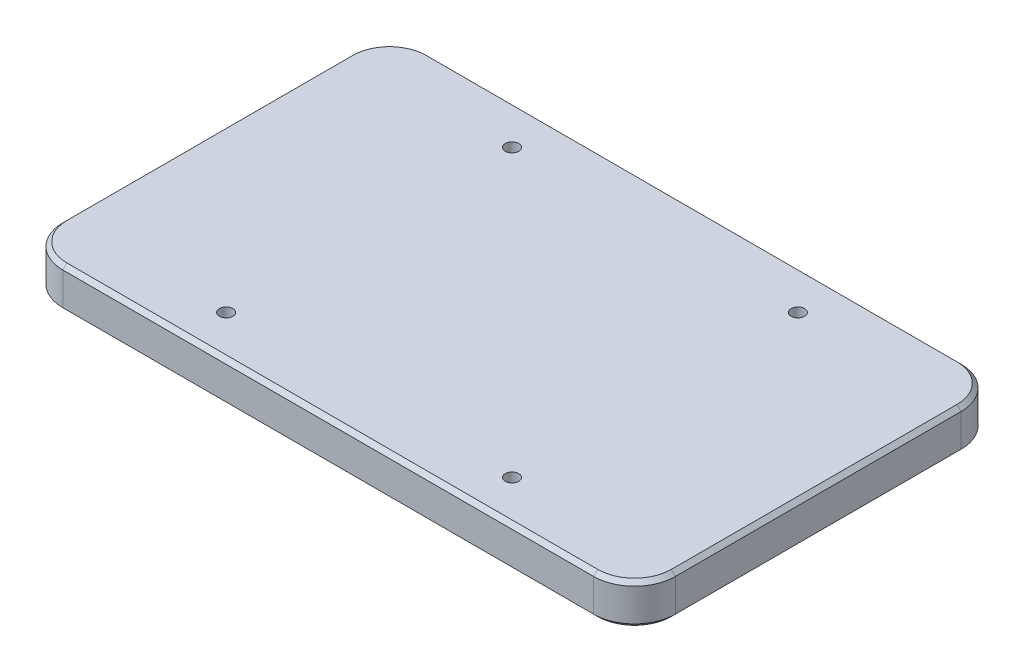
ISO-10303-21;
HEADER;
FILE_DESCRIPTION(('STEP AP214'),'2;1');
FILE_NAME('part.step','',(''),(''),'','','');
FILE_SCHEMA(('AUTOMOTIVE_DESIGN { 1 0 10303 214 1 1 1 1 }'));
ENDSEC;
DATA;
#1=APPLICATION_CONTEXT('core data for automotive mechanical design processes');
#2=APPLICATION_PROTOCOL_DEFINITION('international standard','automotive_design',2000,#1);
#3=PRODUCT_CONTEXT('',#1,'mechanical');
#4=PRODUCT('Part','Part','',(#3));
#5=PRODUCT_RELATED_PRODUCT_CATEGORY('part','',(#4));
#6=PRODUCT_DEFINITION_FORMATION('','',#4);
#7=PRODUCT_DEFINITION_CONTEXT('part definition',#1,'design');
#8=PRODUCT_DEFINITION('design','',#6,#7);
#9=PRODUCT_DEFINITION_SHAPE('','',#8);
#10=(LENGTH_UNIT() NAMED_UNIT(*) SI_UNIT(.MILLI.,.METRE.));
#11=(NAMED_UNIT(*) PLANE_ANGLE_UNIT() SI_UNIT($,.RADIAN.));
#12=(NAMED_UNIT(*) SI_UNIT($,.STERADIAN.) SOLID_ANGLE_UNIT());
#13=UNCERTAINTY_MEASURE_WITH_UNIT(LENGTH_MEASURE(1.E-05),#10,'distance_accuracy_value','');
#14=(GEOMETRIC_REPRESENTATION_CONTEXT(3) GLOBAL_UNCERTAINTY_ASSIGNED_CONTEXT((#13)) GLOBAL_UNIT_ASSIGNED_CONTEXT((#10,
#11,#12)) REPRESENTATION_CONTEXT('',''));
#15=CARTESIAN_POINT('',(0.,0.,0.));
#16=DIRECTION('',(0.,0.,1.));
#17=DIRECTION('',(1.,0.,0.));
#18=AXIS2_PLACEMENT_3D('',#15,#16,#17);
#19=CARTESIAN_POINT('',(0.,10.,0.));
#20=DIRECTION('',(1.,0.,0.));
#21=DIRECTION('',(0.,0.,-1.));
#22=AXIS2_PLACEMENT_3D('',#19,#20,#21);
#23=PLANE('',#22);
#24=DIRECTION('',(0.,-1.,0.));
#25=VECTOR('',#24,1.);
#26=CARTESIAN_POINT('',(0.,10.,80.));
#27=LINE('',#26,#25);
#28=CARTESIAN_POINT('',(0.,1.,80.));
#29=VERTEX_POINT('',#28);
#30=CARTESIAN_POINT('',(0.,9.,80.));
#31=VERTEX_POINT('',#30);
#32=EDGE_CURVE('E234',#29,#31,#27,.F.);
#33=ORIENTED_EDGE('',*,*,#32,.T.);
#34=DIRECTION('',(0.,0.,-1.));
#35=VECTOR('',#34,1.);
#36=CARTESIAN_POINT('',(0.,9.,10.));
#37=LINE('',#36,#35);
#38=CARTESIAN_POINT('',(0.,9.,10.));
#39=VERTEX_POINT('',#38);
#40=EDGE_CURVE('E354',#31,#39,#37,.T.);
#41=ORIENTED_EDGE('',*,*,#40,.T.);
#42=DIRECTION('',(0.,-1.,0.));
#43=VECTOR('',#42,1.);
#44=CARTESIAN_POINT('',(0.,10.,10.));
#45=LINE('',#44,#43);
#46=CARTESIAN_POINT('',(0.,1.,10.));
#47=VERTEX_POINT('',#46);
#48=EDGE_CURVE('E240',#39,#47,#45,.T.);
#49=ORIENTED_EDGE('',*,*,#48,.T.);
#50=DIRECTION('',(0.,0.,1.));
#51=VECTOR('',#50,1.);
#52=CARTESIAN_POINT('',(0.,1.,0.));
#53=LINE('',#52,#51);
#54=EDGE_CURVE('E279',#47,#29,#53,.T.);
#55=ORIENTED_EDGE('',*,*,#54,.T.);
#56=EDGE_LOOP('',(#33,#41,#49,#55));
#57=FACE_BOUND('',#56,.T.);
#58=ADVANCED_FACE('F81',(#57),#23,.F.);
#59=CARTESIAN_POINT('',(0.,10.,90.));
#60=DIRECTION('',(0.,0.,-1.));
#61=DIRECTION('',(-1.,0.,0.));
#62=AXIS2_PLACEMENT_3D('',#59,#60,#61);
#63=PLANE('',#62);
#64=DIRECTION('',(0.,-1.,0.));
#65=VECTOR('',#64,1.);
#66=CARTESIAN_POINT('',(140.,10.,90.));
#67=LINE('',#66,#65);
#68=CARTESIAN_POINT('',(140.,1.,90.));
#69=VERTEX_POINT('',#68);
#70=CARTESIAN_POINT('',(140.,9.,90.));
#71=VERTEX_POINT('',#70);
#72=EDGE_CURVE('E227',#69,#71,#67,.F.);
#73=ORIENTED_EDGE('',*,*,#72,.T.);
#74=DIRECTION('',(-1.,0.,0.));
#75=VECTOR('',#74,1.);
#76=CARTESIAN_POINT('',(10.,9.,90.));
#77=LINE('',#76,#75);
#78=CARTESIAN_POINT('',(10.,9.,90.));
#79=VERTEX_POINT('',#78);
#80=EDGE_CURVE('E343',#71,#79,#77,.T.);
#81=ORIENTED_EDGE('',*,*,#80,.T.);
#82=DIRECTION('',(0.,-1.,0.));
#83=VECTOR('',#82,1.);
#84=CARTESIAN_POINT('',(10.,10.,90.));
#85=LINE('',#84,#83);
#86=CARTESIAN_POINT('',(10.,1.,90.));
#87=VERTEX_POINT('',#86);
#88=EDGE_CURVE('E230',#79,#87,#85,.T.);
#89=ORIENTED_EDGE('',*,*,#88,.T.);
#90=DIRECTION('',(1.,0.,0.));
#91=VECTOR('',#90,1.);
#92=CARTESIAN_POINT('',(0.,1.,90.));
#93=LINE('',#92,#91);
#94=EDGE_CURVE('E202',#87,#69,#93,.T.);
#95=ORIENTED_EDGE('',*,*,#94,.T.);
#96=EDGE_LOOP('',(#73,#81,#89,#95));
#97=FACE_BOUND('',#96,.T.);
#98=ADVANCED_FACE('F225',(#97),#63,.F.);
#99=CARTESIAN_POINT('',(150.,10.,0.));
#100=DIRECTION('',(-1.,0.,0.));
#101=DIRECTION('',(0.,0.,1.));
#102=AXIS2_PLACEMENT_3D('',#99,#100,#101);
#103=PLANE('',#102);
#104=DIRECTION('',(0.,-1.,0.));
#105=VECTOR('',#104,1.);
#106=CARTESIAN_POINT('',(150.,10.,10.));
#107=LINE('',#106,#105);
#108=CARTESIAN_POINT('',(150.,1.,10.));
#109=VERTEX_POINT('',#108);
#110=CARTESIAN_POINT('',(150.,9.,10.));
#111=VERTEX_POINT('',#110);
#112=EDGE_CURVE('E245',#109,#111,#107,.F.);
#113=ORIENTED_EDGE('',*,*,#112,.T.);
#114=DIRECTION('',(0.,0.,1.));
#115=VECTOR('',#114,1.);
#116=CARTESIAN_POINT('',(150.,9.,80.));
#117=LINE('',#116,#115);
#118=CARTESIAN_POINT('',(150.,9.,80.));
#119=VERTEX_POINT('',#118);
#120=EDGE_CURVE('E351',#111,#119,#117,.T.);
#121=ORIENTED_EDGE('',*,*,#120,.T.);
#122=DIRECTION('',(0.,-1.,0.));
#123=VECTOR('',#122,1.);
#124=CARTESIAN_POINT('',(150.,10.,80.));
#125=LINE('',#124,#123);
#126=CARTESIAN_POINT('',(150.,1.,80.));
#127=VERTEX_POINT('',#126);
#128=EDGE_CURVE('E412',#119,#127,#125,.T.);
#129=ORIENTED_EDGE('',*,*,#128,.T.);
#130=DIRECTION('',(0.,0.,-1.));
#131=VECTOR('',#130,1.);
#132=CARTESIAN_POINT('',(150.,1.,0.));
#133=LINE('',#132,#131);
#134=EDGE_CURVE('E276',#127,#109,#133,.T.);
#135=ORIENTED_EDGE('',*,*,#134,.T.);
#136=EDGE_LOOP('',(#113,#121,#129,#135));
#137=FACE_BOUND('',#136,.T.);
#138=ADVANCED_FACE('F410',(#137),#103,.F.);
#139=CARTESIAN_POINT('',(0.,10.,0.));
#140=DIRECTION('',(0.,0.,1.));
#141=DIRECTION('',(1.,0.,0.));
#142=AXIS2_PLACEMENT_3D('',#139,#140,#141);
#143=PLANE('',#142);
#144=DIRECTION('',(0.,-1.,0.));
#145=VECTOR('',#144,1.);
#146=CARTESIAN_POINT('',(10.,10.,0.));
#147=LINE('',#146,#145);
#148=CARTESIAN_POINT('',(10.,1.,0.));
#149=VERTEX_POINT('',#148);
#150=CARTESIAN_POINT('',(10.,9.,0.));
#151=VERTEX_POINT('',#150);
#152=EDGE_CURVE('E318',#149,#151,#147,.F.);
#153=ORIENTED_EDGE('',*,*,#152,.T.);
#154=DIRECTION('',(1.,0.,0.));
#155=VECTOR('',#154,1.);
#156=CARTESIAN_POINT('',(140.,9.,0.));
#157=LINE('',#156,#155);
#158=CARTESIAN_POINT('',(140.,9.,0.));
#159=VERTEX_POINT('',#158);
#160=EDGE_CURVE('E13',#151,#159,#157,.T.);
#161=ORIENTED_EDGE('',*,*,#160,.T.);
#162=DIRECTION('',(0.,-1.,0.));
#163=VECTOR('',#162,1.);
#164=CARTESIAN_POINT('',(140.,10.,0.));
#165=LINE('',#164,#163);
#166=CARTESIAN_POINT('',(140.,1.,0.));
#167=VERTEX_POINT('',#166);
#168=EDGE_CURVE('E408',#159,#167,#165,.T.);
#169=ORIENTED_EDGE('',*,*,#168,.T.);
#170=DIRECTION('',(-1.,0.,0.));
#171=VECTOR('',#170,1.);
#172=CARTESIAN_POINT('',(0.,1.,0.));
#173=LINE('',#172,#171);
#174=EDGE_CURVE('E290',#167,#149,#173,.T.);
#175=ORIENTED_EDGE('',*,*,#174,.T.);
#176=EDGE_LOOP('',(#153,#161,#169,#175));
#177=FACE_BOUND('',#176,.T.);
#178=ADVANCED_FACE('F458',(#177),#143,.F.);
#179=CARTESIAN_POINT('',(0.,10.,0.));
#180=DIRECTION('',(0.,1.,0.));
#181=DIRECTION('',(0.,0.,1.));
#182=AXIS2_PLACEMENT_3D('',#179,#180,#181);
#183=PLANE('',#182);
#184=CARTESIAN_POINT('',(40.,10.,10.));
#185=DIRECTION('',(0.,1.,0.));
#186=DIRECTION('',(0.,0.,1.));
#187=AXIS2_PLACEMENT_3D('',#184,#185,#186);
#188=CIRCLE('',#187,1.64999999999999);
#189=CARTESIAN_POINT('',(40.,10.,11.65));
#190=VERTEX_POINT('',#189);
#191=EDGE_CURVE('E447',#190,#190,#188,.T.);
#192=ORIENTED_EDGE('',*,*,#191,.F.);
#193=EDGE_LOOP('',(#192));
#194=FACE_BOUND('',#193,.T.);
#195=CARTESIAN_POINT('',(110.,10.,10.));
#196=DIRECTION('',(0.,1.,0.));
#197=DIRECTION('',(0.,0.,1.));
#198=AXIS2_PLACEMENT_3D('',#195,#196,#197);
#199=CIRCLE('',#198,1.64999999999998);
#200=CARTESIAN_POINT('',(110.,10.,11.65));
#201=VERTEX_POINT('',#200);
#202=EDGE_CURVE('E439',#201,#201,#199,.T.);
#203=ORIENTED_EDGE('',*,*,#202,.F.);
#204=EDGE_LOOP('',(#203));
#205=FACE_BOUND('',#204,.T.);
#206=CARTESIAN_POINT('',(40.,10.,80.));
#207=DIRECTION('',(0.,1.,0.));
#208=DIRECTION('',(0.,0.,1.));
#209=AXIS2_PLACEMENT_3D('',#206,#207,#208);
#210=CIRCLE('',#209,1.64999999999998);
#211=CARTESIAN_POINT('',(40.,10.,81.65));
#212=VERTEX_POINT('',#211);
#213=EDGE_CURVE('E431',#212,#212,#210,.T.);
#214=ORIENTED_EDGE('',*,*,#213,.F.);
#215=EDGE_LOOP('',(#214));
#216=FACE_BOUND('',#215,.T.);
#217=CARTESIAN_POINT('',(110.,10.,80.));
#218=DIRECTION('',(0.,1.,0.));
#219=DIRECTION('',(0.,0.,1.));
#220=AXIS2_PLACEMENT_3D('',#217,#218,#219);
#221=CIRCLE('',#220,1.64999999999998);
#222=CARTESIAN_POINT('',(110.,10.,81.65));
#223=VERTEX_POINT('',#222);
#224=EDGE_CURVE('E423',#223,#223,#221,.T.);
#225=ORIENTED_EDGE('',*,*,#224,.F.);
#226=EDGE_LOOP('',(#225));
#227=FACE_BOUND('',#226,.T.);
#228=CARTESIAN_POINT('',(10.,10.,80.));
#229=DIRECTION('',(0.,1.,0.));
#230=DIRECTION('',(0.,0.,1.));
#231=AXIS2_PLACEMENT_3D('',#228,#229,#230);
#232=CIRCLE('',#231,8.99999999999999);
#233=CARTESIAN_POINT('',(1.00000000000001,10.,80.));
#234=VERTEX_POINT('',#233);
#235=CARTESIAN_POINT('',(10.,10.,89.));
#236=VERTEX_POINT('',#235);
#237=EDGE_CURVE('E333',#234,#236,#232,.T.);
#238=ORIENTED_EDGE('',*,*,#237,.T.);
#239=DIRECTION('',(1.,0.,0.));
#240=VECTOR('',#239,1.);
#241=CARTESIAN_POINT('',(140.,10.,89.));
#242=LINE('',#241,#240);
#243=CARTESIAN_POINT('',(140.,10.,89.));
#244=VERTEX_POINT('',#243);
#245=EDGE_CURVE('E339',#236,#244,#242,.T.);
#246=ORIENTED_EDGE('',*,*,#245,.T.);
#247=CARTESIAN_POINT('',(140.,10.,80.));
#248=DIRECTION('',(0.,1.,0.));
#249=DIRECTION('',(0.,0.,1.));
#250=AXIS2_PLACEMENT_3D('',#247,#248,#249);
#251=CIRCLE('',#250,8.99999999999998);
#252=CARTESIAN_POINT('',(149.,10.,80.));
#253=VERTEX_POINT('',#252);
#254=EDGE_CURVE('E336',#244,#253,#251,.T.);
#255=ORIENTED_EDGE('',*,*,#254,.T.);
#256=DIRECTION('',(0.,0.,-1.));
#257=VECTOR('',#256,1.);
#258=CARTESIAN_POINT('',(149.,10.,10.));
#259=LINE('',#258,#257);
#260=CARTESIAN_POINT('',(149.,10.,10.));
#261=VERTEX_POINT('',#260);
#262=EDGE_CURVE('E330',#253,#261,#259,.T.);
#263=ORIENTED_EDGE('',*,*,#262,.T.);
#264=CARTESIAN_POINT('',(140.,10.,10.));
#265=DIRECTION('',(0.,1.,0.));
#266=DIRECTION('',(0.,0.,1.));
#267=AXIS2_PLACEMENT_3D('',#264,#265,#266);
#268=CIRCLE('',#267,9.00000000000001);
#269=CARTESIAN_POINT('',(140.,10.,1.));
#270=VERTEX_POINT('',#269);
#271=EDGE_CURVE('E324',#261,#270,#268,.T.);
#272=ORIENTED_EDGE('',*,*,#271,.T.);
#273=DIRECTION('',(-1.,0.,0.));
#274=VECTOR('',#273,1.);
#275=CARTESIAN_POINT('',(10.,10.,1.));
#276=LINE('',#275,#274);
#277=CARTESIAN_POINT('',(10.,10.,1.));
#278=VERTEX_POINT('',#277);
#279=EDGE_CURVE('E292',#270,#278,#276,.T.);
#280=ORIENTED_EDGE('',*,*,#279,.T.);
#281=CARTESIAN_POINT('',(10.,10.,10.));
#282=DIRECTION('',(0.,1.,0.));
#283=DIRECTION('',(0.,0.,1.));
#284=AXIS2_PLACEMENT_3D('',#281,#282,#283);
#285=CIRCLE('',#284,9.);
#286=CARTESIAN_POINT('',(1.,10.,10.));
#287=VERTEX_POINT('',#286);
#288=EDGE_CURVE('E321',#278,#287,#285,.T.);
#289=ORIENTED_EDGE('',*,*,#288,.T.);
#290=DIRECTION('',(0.,0.,1.));
#291=VECTOR('',#290,1.);
#292=CARTESIAN_POINT('',(1.00000000000001,10.,80.));
#293=LINE('',#292,#291);
#294=EDGE_CURVE('E327',#287,#234,#293,.T.);
#295=ORIENTED_EDGE('',*,*,#294,.T.);
#296=EDGE_LOOP('',(#238,#246,#255,#263,#272,#280,#289,#295));
#297=FACE_BOUND('',#296,.T.);
#298=ADVANCED_FACE('F454',(#194,#205,#216,#227,#297),#183,.T.);
#299=CARTESIAN_POINT('',(0.,0.,0.));
#300=DIRECTION('',(0.,1.,0.));
#301=DIRECTION('',(0.,0.,1.));
#302=AXIS2_PLACEMENT_3D('',#299,#300,#301);
#303=PLANE('',#302);
#304=CARTESIAN_POINT('',(40.,0.,10.));
#305=DIRECTION('',(0.,1.,0.));
#306=DIRECTION('',(0.,0.,1.));
#307=AXIS2_PLACEMENT_3D('',#304,#305,#306);
#308=CIRCLE('',#307,1.64999999999999);
#309=CARTESIAN_POINT('',(40.,0.,11.65));
#310=VERTEX_POINT('',#309);
#311=EDGE_CURVE('E443',#310,#310,#308,.T.);
#312=ORIENTED_EDGE('',*,*,#311,.T.);
#313=EDGE_LOOP('',(#312));
#314=FACE_BOUND('',#313,.T.);
#315=CARTESIAN_POINT('',(110.,0.,10.));
#316=DIRECTION('',(0.,1.,0.));
#317=DIRECTION('',(0.,0.,1.));
#318=AXIS2_PLACEMENT_3D('',#315,#316,#317);
#319=CIRCLE('',#318,1.64999999999998);
#320=CARTESIAN_POINT('',(110.,0.,11.65));
#321=VERTEX_POINT('',#320);
#322=EDGE_CURVE('E435',#321,#321,#319,.T.);
#323=ORIENTED_EDGE('',*,*,#322,.T.);
#324=EDGE_LOOP('',(#323));
#325=FACE_BOUND('',#324,.T.);
#326=CARTESIAN_POINT('',(40.,0.,80.));
#327=DIRECTION('',(0.,1.,0.));
#328=DIRECTION('',(0.,0.,1.));
#329=AXIS2_PLACEMENT_3D('',#326,#327,#328);
#330=CIRCLE('',#329,1.64999999999998);
#331=CARTESIAN_POINT('',(40.,0.,81.65));
#332=VERTEX_POINT('',#331);
#333=EDGE_CURVE('E427',#332,#332,#330,.T.);
#334=ORIENTED_EDGE('',*,*,#333,.T.);
#335=EDGE_LOOP('',(#334));
#336=FACE_BOUND('',#335,.T.);
#337=CARTESIAN_POINT('',(110.,0.,80.));
#338=DIRECTION('',(0.,1.,0.));
#339=DIRECTION('',(0.,0.,1.));
#340=AXIS2_PLACEMENT_3D('',#337,#338,#339);
#341=CIRCLE('',#340,1.64999999999998);
#342=CARTESIAN_POINT('',(110.,0.,81.65));
#343=VERTEX_POINT('',#342);
#344=EDGE_CURVE('E366',#343,#343,#341,.T.);
#345=ORIENTED_EDGE('',*,*,#344,.T.);
#346=EDGE_LOOP('',(#345));
#347=FACE_BOUND('',#346,.T.);
#348=CARTESIAN_POINT('',(140.,0.,80.));
#349=DIRECTION('',(0.,1.,0.));
#350=DIRECTION('',(0.,0.,1.));
#351=AXIS2_PLACEMENT_3D('',#348,#349,#350);
#352=CIRCLE('',#351,8.99999999999999);
#353=CARTESIAN_POINT('',(149.,0.,80.));
#354=VERTEX_POINT('',#353);
#355=CARTESIAN_POINT('',(140.,0.,89.));
#356=VERTEX_POINT('',#355);
#357=EDGE_CURVE('E269',#354,#356,#352,.F.);
#358=ORIENTED_EDGE('',*,*,#357,.T.);
#359=DIRECTION('',(-1.,0.,0.));
#360=VECTOR('',#359,1.);
#361=CARTESIAN_POINT('',(0.,0.,89.));
#362=LINE('',#361,#360);
#363=CARTESIAN_POINT('',(10.,0.,89.));
#364=VERTEX_POINT('',#363);
#365=EDGE_CURVE('E204',#356,#364,#362,.T.);
#366=ORIENTED_EDGE('',*,*,#365,.T.);
#367=CARTESIAN_POINT('',(10.,0.,80.));
#368=DIRECTION('',(0.,1.,0.));
#369=DIRECTION('',(0.,0.,1.));
#370=AXIS2_PLACEMENT_3D('',#367,#368,#369);
#371=CIRCLE('',#370,9.);
#372=CARTESIAN_POINT('',(1.00000000000001,0.,80.));
#373=VERTEX_POINT('',#372);
#374=EDGE_CURVE('E266',#364,#373,#371,.F.);
#375=ORIENTED_EDGE('',*,*,#374,.T.);
#376=DIRECTION('',(0.,0.,-1.));
#377=VECTOR('',#376,1.);
#378=CARTESIAN_POINT('',(1.,0.,0.));
#379=LINE('',#378,#377);
#380=CARTESIAN_POINT('',(1.,0.,10.));
#381=VERTEX_POINT('',#380);
#382=EDGE_CURVE('E260',#373,#381,#379,.T.);
#383=ORIENTED_EDGE('',*,*,#382,.T.);
#384=CARTESIAN_POINT('',(10.,0.,10.));
#385=DIRECTION('',(0.,1.,0.));
#386=DIRECTION('',(0.,0.,1.));
#387=AXIS2_PLACEMENT_3D('',#384,#385,#386);
#388=CIRCLE('',#387,9.);
#389=CARTESIAN_POINT('',(10.,0.,1.));
#390=VERTEX_POINT('',#389);
#391=EDGE_CURVE('E254',#381,#390,#388,.F.);
#392=ORIENTED_EDGE('',*,*,#391,.T.);
#393=DIRECTION('',(1.,0.,0.));
#394=VECTOR('',#393,1.);
#395=CARTESIAN_POINT('',(0.,0.,1.));
#396=LINE('',#395,#394);
#397=CARTESIAN_POINT('',(140.,0.,1.));
#398=VERTEX_POINT('',#397);
#399=EDGE_CURVE('E233',#390,#398,#396,.T.);
#400=ORIENTED_EDGE('',*,*,#399,.T.);
#401=CARTESIAN_POINT('',(140.,0.,10.));
#402=DIRECTION('',(0.,1.,0.));
#403=DIRECTION('',(0.,0.,1.));
#404=AXIS2_PLACEMENT_3D('',#401,#402,#403);
#405=CIRCLE('',#404,9.00000000000001);
#406=CARTESIAN_POINT('',(149.,0.,10.));
#407=VERTEX_POINT('',#406);
#408=EDGE_CURVE('E257',#398,#407,#405,.F.);
#409=ORIENTED_EDGE('',*,*,#408,.T.);
#410=DIRECTION('',(0.,0.,1.));
#411=VECTOR('',#410,1.);
#412=CARTESIAN_POINT('',(149.,0.,0.));
#413=LINE('',#412,#411);
#414=EDGE_CURVE('E263',#407,#354,#413,.T.);
#415=ORIENTED_EDGE('',*,*,#414,.T.);
#416=EDGE_LOOP('',(#358,#366,#375,#383,#392,#400,#409,#415));
#417=FACE_BOUND('',#416,.T.);
#418=ADVANCED_FACE('F457',(#314,#325,#336,#347,#417),#303,.F.);
#419=CARTESIAN_POINT('',(140.,10.,10.));
#420=DIRECTION('',(0.,-1.,0.));
#421=DIRECTION('',(0.,0.,-1.));
#422=AXIS2_PLACEMENT_3D('',#419,#420,#421);
#423=CYLINDRICAL_SURFACE('',#422,10.);
#424=ORIENTED_EDGE('',*,*,#168,.F.);
#425=CARTESIAN_POINT('',(140.,9.,10.));
#426=DIRECTION('',(0.,1.,0.));
#427=DIRECTION('',(0.,0.,1.));
#428=AXIS2_PLACEMENT_3D('',#425,#426,#427);
#429=CIRCLE('',#428,10.);
#430=EDGE_CURVE('E357',#159,#111,#429,.F.);
#431=ORIENTED_EDGE('',*,*,#430,.T.);
#432=ORIENTED_EDGE('',*,*,#112,.F.);
#433=CARTESIAN_POINT('',(140.,1.,10.));
#434=DIRECTION('',(0.,1.,0.));
#435=DIRECTION('',(0.,0.,1.));
#436=AXIS2_PLACEMENT_3D('',#433,#434,#435);
#437=CIRCLE('',#436,10.);
#438=EDGE_CURVE('E282',#109,#167,#437,.T.);
#439=ORIENTED_EDGE('',*,*,#438,.T.);
#440=EDGE_LOOP('',(#424,#431,#432,#439));
#441=FACE_BOUND('',#440,.T.);
#442=ADVANCED_FACE('F406',(#441),#423,.T.);
#443=CARTESIAN_POINT('',(140.,10.,80.));
#444=DIRECTION('',(0.,-1.,0.));
#445=DIRECTION('',(0.,0.,-1.));
#446=AXIS2_PLACEMENT_3D('',#443,#444,#445);
#447=CYLINDRICAL_SURFACE('',#446,10.);
#448=ORIENTED_EDGE('',*,*,#128,.F.);
#449=CARTESIAN_POINT('',(140.,9.,80.));
#450=DIRECTION('',(0.,1.,0.));
#451=DIRECTION('',(0.,0.,1.));
#452=AXIS2_PLACEMENT_3D('',#449,#450,#451);
#453=CIRCLE('',#452,10.);
#454=EDGE_CURVE('E238',#119,#71,#453,.F.);
#455=ORIENTED_EDGE('',*,*,#454,.T.);
#456=ORIENTED_EDGE('',*,*,#72,.F.);
#457=CARTESIAN_POINT('',(140.,1.,80.));
#458=DIRECTION('',(0.,1.,0.));
#459=DIRECTION('',(0.,0.,1.));
#460=AXIS2_PLACEMENT_3D('',#457,#458,#459);
#461=CIRCLE('',#460,10.);
#462=EDGE_CURVE('E212',#69,#127,#461,.T.);
#463=ORIENTED_EDGE('',*,*,#462,.T.);
#464=EDGE_LOOP('',(#448,#455,#456,#463));
#465=FACE_BOUND('',#464,.T.);
#466=ADVANCED_FACE('F236',(#465),#447,.T.);
#467=CARTESIAN_POINT('',(10.,10.,80.));
#468=DIRECTION('',(0.,-1.,0.));
#469=DIRECTION('',(0.,0.,-1.));
#470=AXIS2_PLACEMENT_3D('',#467,#468,#469);
#471=CYLINDRICAL_SURFACE('',#470,10.);
#472=ORIENTED_EDGE('',*,*,#88,.F.);
#473=CARTESIAN_POINT('',(10.,9.,80.));
#474=DIRECTION('',(0.,1.,0.));
#475=DIRECTION('',(0.,0.,1.));
#476=AXIS2_PLACEMENT_3D('',#473,#474,#475);
#477=CIRCLE('',#476,10.);
#478=EDGE_CURVE('E348',#79,#31,#477,.F.);
#479=ORIENTED_EDGE('',*,*,#478,.T.);
#480=ORIENTED_EDGE('',*,*,#32,.F.);
#481=CARTESIAN_POINT('',(10.,1.,80.));
#482=DIRECTION('',(0.,1.,0.));
#483=DIRECTION('',(0.,0.,1.));
#484=AXIS2_PLACEMENT_3D('',#481,#482,#483);
#485=CIRCLE('',#484,10.);
#486=EDGE_CURVE('E221',#29,#87,#485,.T.);
#487=ORIENTED_EDGE('',*,*,#486,.T.);
#488=EDGE_LOOP('',(#472,#479,#480,#487));
#489=FACE_BOUND('',#488,.T.);
#490=ADVANCED_FACE('F508',(#489),#471,.T.);
#491=CARTESIAN_POINT('',(10.,10.,10.));
#492=DIRECTION('',(0.,-1.,0.));
#493=DIRECTION('',(0.,0.,-1.));
#494=AXIS2_PLACEMENT_3D('',#491,#492,#493);
#495=CYLINDRICAL_SURFACE('',#494,10.);
#496=ORIENTED_EDGE('',*,*,#48,.F.);
#497=CARTESIAN_POINT('',(10.,9.,10.));
#498=DIRECTION('',(0.,1.,0.));
#499=DIRECTION('',(0.,0.,1.));
#500=AXIS2_PLACEMENT_3D('',#497,#498,#499);
#501=CIRCLE('',#500,10.);
#502=EDGE_CURVE('E92',#39,#151,#501,.F.);
#503=ORIENTED_EDGE('',*,*,#502,.T.);
#504=ORIENTED_EDGE('',*,*,#152,.F.);
#505=CARTESIAN_POINT('',(10.,1.,10.));
#506=DIRECTION('',(0.,1.,0.));
#507=DIRECTION('',(0.,0.,1.));
#508=AXIS2_PLACEMENT_3D('',#505,#506,#507);
#509=CIRCLE('',#508,10.);
#510=EDGE_CURVE('E286',#149,#47,#509,.T.);
#511=ORIENTED_EDGE('',*,*,#510,.T.);
#512=EDGE_LOOP('',(#496,#503,#504,#511));
#513=FACE_BOUND('',#512,.T.);
#514=ADVANCED_FACE('F511',(#513),#495,.T.);
#515=CARTESIAN_POINT('',(0.,1.,0.));
#516=DIRECTION('',(0.,0.707106781186547,0.707106781186547));
#517=DIRECTION('',(-1.,0.,0.));
#518=AXIS2_PLACEMENT_3D('',#515,#516,#517);
#519=PLANE('',#518);
#520=DIRECTION('',(0.,0.707106781186547,-0.707106781186547));
#521=VECTOR('',#520,1.);
#522=CARTESIAN_POINT('',(140.,0.,1.));
#523=LINE('',#522,#521);
#524=EDGE_CURVE('E310',#398,#167,#523,.T.);
#525=ORIENTED_EDGE('',*,*,#524,.F.);
#526=ORIENTED_EDGE('',*,*,#399,.F.);
#527=DIRECTION('',(0.,-0.707106781186547,0.707106781186547));
#528=VECTOR('',#527,1.);
#529=CARTESIAN_POINT('',(10.,1.,0.));
#530=LINE('',#529,#528);
#531=EDGE_CURVE('E314',#149,#390,#530,.T.);
#532=ORIENTED_EDGE('',*,*,#531,.F.);
#533=ORIENTED_EDGE('',*,*,#174,.F.);
#534=EDGE_LOOP('',(#525,#526,#532,#533));
#535=FACE_BOUND('',#534,.T.);
#536=ADVANCED_FACE('F515',(#535),#519,.F.);
#537=CARTESIAN_POINT('',(10.,0.,10.));
#538=DIRECTION('',(0.,1.,0.));
#539=DIRECTION('',(0.,0.,1.));
#540=AXIS2_PLACEMENT_3D('',#537,#538,#539);
#541=CONICAL_SURFACE('',#540,9.,0.785398163397448);
#542=ORIENTED_EDGE('',*,*,#531,.T.);
#543=ORIENTED_EDGE('',*,*,#391,.F.);
#544=DIRECTION('',(0.707106781186547,-0.707106781186548,0.));
#545=VECTOR('',#544,1.);
#546=CARTESIAN_POINT('',(0.,1.,10.));
#547=LINE('',#546,#545);
#548=EDGE_CURVE('E306',#47,#381,#547,.T.);
#549=ORIENTED_EDGE('',*,*,#548,.F.);
#550=ORIENTED_EDGE('',*,*,#510,.F.);
#551=EDGE_LOOP('',(#542,#543,#549,#550));
#552=FACE_BOUND('',#551,.T.);
#553=ADVANCED_FACE('F554',(#552),#541,.T.);
#554=CARTESIAN_POINT('',(140.,0.,10.));
#555=DIRECTION('',(0.,1.,0.));
#556=DIRECTION('',(0.,0.,1.));
#557=AXIS2_PLACEMENT_3D('',#554,#555,#556);
#558=CONICAL_SURFACE('',#557,9.00000000000001,0.785398163397444);
#559=ORIENTED_EDGE('',*,*,#524,.T.);
#560=ORIENTED_EDGE('',*,*,#438,.F.);
#561=DIRECTION('',(0.707106781186548,0.707106781186547,0.));
#562=VECTOR('',#561,1.);
#563=CARTESIAN_POINT('',(149.,0.,10.));
#564=LINE('',#563,#562);
#565=EDGE_CURVE('E302',#407,#109,#564,.T.);
#566=ORIENTED_EDGE('',*,*,#565,.F.);
#567=ORIENTED_EDGE('',*,*,#408,.F.);
#568=EDGE_LOOP('',(#559,#560,#566,#567));
#569=FACE_BOUND('',#568,.T.);
#570=ADVANCED_FACE('F547',(#569),#558,.T.);
#571=CARTESIAN_POINT('',(0.,1.,0.));
#572=DIRECTION('',(0.707106781186547,0.707106781186547,0.));
#573=DIRECTION('',(0.,0.,1.));
#574=AXIS2_PLACEMENT_3D('',#571,#572,#573);
#575=PLANE('',#574);
#576=ORIENTED_EDGE('',*,*,#548,.T.);
#577=ORIENTED_EDGE('',*,*,#382,.F.);
#578=DIRECTION('',(0.707106781186547,-0.707106781186547,0.));
#579=VECTOR('',#578,1.);
#580=CARTESIAN_POINT('',(0.,1.,80.));
#581=LINE('',#580,#579);
#582=EDGE_CURVE('E298',#29,#373,#581,.T.);
#583=ORIENTED_EDGE('',*,*,#582,.F.);
#584=ORIENTED_EDGE('',*,*,#54,.F.);
#585=EDGE_LOOP('',(#576,#577,#583,#584));
#586=FACE_BOUND('',#585,.T.);
#587=ADVANCED_FACE('F540',(#586),#575,.F.);
#588=CARTESIAN_POINT('',(150.,1.,0.));
#589=DIRECTION('',(-0.707106781186547,0.707106781186547,0.));
#590=DIRECTION('',(0.,0.,-1.));
#591=AXIS2_PLACEMENT_3D('',#588,#589,#590);
#592=PLANE('',#591);
#593=ORIENTED_EDGE('',*,*,#565,.T.);
#594=ORIENTED_EDGE('',*,*,#134,.F.);
#595=DIRECTION('',(0.707106781186547,0.707106781186547,0.));
#596=VECTOR('',#595,1.);
#597=CARTESIAN_POINT('',(149.,0.,80.));
#598=LINE('',#597,#596);
#599=EDGE_CURVE('E215',#354,#127,#598,.T.);
#600=ORIENTED_EDGE('',*,*,#599,.F.);
#601=ORIENTED_EDGE('',*,*,#414,.F.);
#602=EDGE_LOOP('',(#593,#594,#600,#601));
#603=FACE_BOUND('',#602,.T.);
#604=ADVANCED_FACE('F533',(#603),#592,.F.);
#605=CARTESIAN_POINT('',(10.,0.,80.));
#606=DIRECTION('',(0.,1.,0.));
#607=DIRECTION('',(0.,0.,1.));
#608=AXIS2_PLACEMENT_3D('',#605,#606,#607);
#609=CONICAL_SURFACE('',#608,9.,0.785398163397448);
#610=ORIENTED_EDGE('',*,*,#582,.T.);
#611=ORIENTED_EDGE('',*,*,#374,.F.);
#612=DIRECTION('',(0.,-0.707106781186547,-0.707106781186547));
#613=VECTOR('',#612,1.);
#614=CARTESIAN_POINT('',(10.,1.,90.));
#615=LINE('',#614,#613);
#616=EDGE_CURVE('E208',#87,#364,#615,.T.);
#617=ORIENTED_EDGE('',*,*,#616,.F.);
#618=ORIENTED_EDGE('',*,*,#486,.F.);
#619=EDGE_LOOP('',(#610,#611,#617,#618));
#620=FACE_BOUND('',#619,.T.);
#621=ADVANCED_FACE('F527',(#620),#609,.T.);
#622=CARTESIAN_POINT('',(140.,0.,80.));
#623=DIRECTION('',(0.,1.,0.));
#624=DIRECTION('',(0.,0.,1.));
#625=AXIS2_PLACEMENT_3D('',#622,#623,#624);
#626=CONICAL_SURFACE('',#625,8.99999999999999,0.785398163397451);
#627=ORIENTED_EDGE('',*,*,#599,.T.);
#628=ORIENTED_EDGE('',*,*,#462,.F.);
#629=DIRECTION('',(0.,0.707106781186547,0.707106781186547));
#630=VECTOR('',#629,1.);
#631=CARTESIAN_POINT('',(140.,0.,89.));
#632=LINE('',#631,#630);
#633=EDGE_CURVE('E198',#356,#69,#632,.T.);
#634=ORIENTED_EDGE('',*,*,#633,.F.);
#635=ORIENTED_EDGE('',*,*,#357,.F.);
#636=EDGE_LOOP('',(#627,#628,#634,#635));
#637=FACE_BOUND('',#636,.T.);
#638=ADVANCED_FACE('F213',(#637),#626,.T.);
#639=CARTESIAN_POINT('',(0.,1.,90.));
#640=DIRECTION('',(0.,0.707106781186547,-0.707106781186547));
#641=DIRECTION('',(1.,0.,0.));
#642=AXIS2_PLACEMENT_3D('',#639,#640,#641);
#643=PLANE('',#642);
#644=ORIENTED_EDGE('',*,*,#616,.T.);
#645=ORIENTED_EDGE('',*,*,#365,.F.);
#646=ORIENTED_EDGE('',*,*,#633,.T.);
#647=ORIENTED_EDGE('',*,*,#94,.F.);
#648=EDGE_LOOP('',(#644,#645,#646,#647));
#649=FACE_BOUND('',#648,.T.);
#650=ADVANCED_FACE('F200',(#649),#643,.F.);
#651=CARTESIAN_POINT('',(0.,10.,1.));
#652=DIRECTION('',(0.,0.707106781186547,-0.707106781186547));
#653=DIRECTION('',(1.,0.,0.));
#654=AXIS2_PLACEMENT_3D('',#651,#652,#653);
#655=PLANE('',#654);
#656=DIRECTION('',(0.,0.707106781186547,0.707106781186547));
#657=VECTOR('',#656,1.);
#658=CARTESIAN_POINT('',(140.,9.,0.));
#659=LINE('',#658,#657);
#660=EDGE_CURVE('E384',#159,#270,#659,.T.);
#661=ORIENTED_EDGE('',*,*,#660,.F.);
#662=ORIENTED_EDGE('',*,*,#160,.F.);
#663=DIRECTION('',(0.,-0.707106781186547,-0.707106781186547));
#664=VECTOR('',#663,1.);
#665=CARTESIAN_POINT('',(10.,10.,1.));
#666=LINE('',#665,#664);
#667=EDGE_CURVE('E86',#278,#151,#666,.T.);
#668=ORIENTED_EDGE('',*,*,#667,.F.);
#669=ORIENTED_EDGE('',*,*,#279,.F.);
#670=EDGE_LOOP('',(#661,#662,#668,#669));
#671=FACE_BOUND('',#670,.T.);
#672=ADVANCED_FACE('F84',(#671),#655,.T.);
#673=CARTESIAN_POINT('',(10.,10.,10.));
#674=DIRECTION('',(0.,-1.,0.));
#675=DIRECTION('',(0.,0.,-1.));
#676=AXIS2_PLACEMENT_3D('',#673,#674,#675);
#677=CONICAL_SURFACE('',#676,9.,0.785398163397448);
#678=ORIENTED_EDGE('',*,*,#667,.T.);
#679=ORIENTED_EDGE('',*,*,#502,.F.);
#680=DIRECTION('',(-0.707106781186547,-0.707106781186548,0.));
#681=VECTOR('',#680,1.);
#682=CARTESIAN_POINT('',(1.,10.,10.));
#683=LINE('',#682,#681);
#684=EDGE_CURVE('E381',#287,#39,#683,.T.);
#685=ORIENTED_EDGE('',*,*,#684,.F.);
#686=ORIENTED_EDGE('',*,*,#288,.F.);
#687=EDGE_LOOP('',(#678,#679,#685,#686));
#688=FACE_BOUND('',#687,.T.);
#689=ADVANCED_FACE('F396',(#688),#677,.T.);
#690=CARTESIAN_POINT('',(140.,10.,10.));
#691=DIRECTION('',(0.,-1.,0.));
#692=DIRECTION('',(0.,0.,-1.));
#693=AXIS2_PLACEMENT_3D('',#690,#691,#692);
#694=CONICAL_SURFACE('',#693,9.00000000000001,0.785398163397444);
#695=ORIENTED_EDGE('',*,*,#660,.T.);
#696=ORIENTED_EDGE('',*,*,#271,.F.);
#697=DIRECTION('',(-0.707106781186547,0.707106781186547,0.));
#698=VECTOR('',#697,1.);
#699=CARTESIAN_POINT('',(150.,9.,10.));
#700=LINE('',#699,#698);
#701=EDGE_CURVE('E377',#111,#261,#700,.T.);
#702=ORIENTED_EDGE('',*,*,#701,.F.);
#703=ORIENTED_EDGE('',*,*,#430,.F.);
#704=EDGE_LOOP('',(#695,#696,#702,#703));
#705=FACE_BOUND('',#704,.T.);
#706=ADVANCED_FACE('F401',(#705),#694,.T.);
#707=CARTESIAN_POINT('',(1.,10.,0.));
#708=DIRECTION('',(-0.707106781186547,0.707106781186547,0.));
#709=DIRECTION('',(0.,0.,-1.));
#710=AXIS2_PLACEMENT_3D('',#707,#708,#709);
#711=PLANE('',#710);
#712=ORIENTED_EDGE('',*,*,#684,.T.);
#713=ORIENTED_EDGE('',*,*,#40,.F.);
#714=DIRECTION('',(-0.707106781186547,-0.707106781186547,0.));
#715=VECTOR('',#714,1.);
#716=CARTESIAN_POINT('',(1.00000000000001,10.,80.));
#717=LINE('',#716,#715);
#718=EDGE_CURVE('E373',#234,#31,#717,.T.);
#719=ORIENTED_EDGE('',*,*,#718,.F.);
#720=ORIENTED_EDGE('',*,*,#294,.F.);
#721=EDGE_LOOP('',(#712,#713,#719,#720));
#722=FACE_BOUND('',#721,.T.);
#723=ADVANCED_FACE('F485',(#722),#711,.T.);
#724=CARTESIAN_POINT('',(149.,10.,0.));
#725=DIRECTION('',(0.707106781186547,0.707106781186547,0.));
#726=DIRECTION('',(0.,0.,1.));
#727=AXIS2_PLACEMENT_3D('',#724,#725,#726);
#728=PLANE('',#727);
#729=ORIENTED_EDGE('',*,*,#701,.T.);
#730=ORIENTED_EDGE('',*,*,#262,.F.);
#731=DIRECTION('',(-0.707106781186547,0.707106781186547,0.));
#732=VECTOR('',#731,1.);
#733=CARTESIAN_POINT('',(150.,9.,80.));
#734=LINE('',#733,#732);
#735=EDGE_CURVE('E369',#119,#253,#734,.T.);
#736=ORIENTED_EDGE('',*,*,#735,.F.);
#737=ORIENTED_EDGE('',*,*,#120,.F.);
#738=EDGE_LOOP('',(#729,#730,#736,#737));
#739=FACE_BOUND('',#738,.T.);
#740=ADVANCED_FACE('F483',(#739),#728,.T.);
#741=CARTESIAN_POINT('',(10.,10.,80.));
#742=DIRECTION('',(0.,-1.,0.));
#743=DIRECTION('',(0.,0.,-1.));
#744=AXIS2_PLACEMENT_3D('',#741,#742,#743);
#745=CONICAL_SURFACE('',#744,9.,0.785398163397448);
#746=ORIENTED_EDGE('',*,*,#718,.T.);
#747=ORIENTED_EDGE('',*,*,#478,.F.);
#748=DIRECTION('',(0.,-0.707106781186547,0.707106781186547));
#749=VECTOR('',#748,1.);
#750=CARTESIAN_POINT('',(10.,10.,89.));
#751=LINE('',#750,#749);
#752=EDGE_CURVE('E365',#236,#79,#751,.T.);
#753=ORIENTED_EDGE('',*,*,#752,.F.);
#754=ORIENTED_EDGE('',*,*,#237,.F.);
#755=EDGE_LOOP('',(#746,#747,#753,#754));
#756=FACE_BOUND('',#755,.T.);
#757=ADVANCED_FACE('F473',(#756),#745,.T.);
#758=CARTESIAN_POINT('',(140.,10.,80.));
#759=DIRECTION('',(0.,-1.,0.));
#760=DIRECTION('',(0.,0.,-1.));
#761=AXIS2_PLACEMENT_3D('',#758,#759,#760);
#762=CONICAL_SURFACE('',#761,8.99999999999999,0.785398163397451);
#763=ORIENTED_EDGE('',*,*,#735,.T.);
#764=ORIENTED_EDGE('',*,*,#254,.F.);
#765=DIRECTION('',(0.,0.707106781186542,-0.707106781186552));
#766=VECTOR('',#765,1.);
#767=CARTESIAN_POINT('',(140.,9.,90.));
#768=LINE('',#767,#766);
#769=EDGE_CURVE('E362',#71,#244,#768,.T.);
#770=ORIENTED_EDGE('',*,*,#769,.F.);
#771=ORIENTED_EDGE('',*,*,#454,.F.);
#772=EDGE_LOOP('',(#763,#764,#770,#771));
#773=FACE_BOUND('',#772,.T.);
#774=ADVANCED_FACE('F479',(#773),#762,.T.);
#775=CARTESIAN_POINT('',(0.,10.,89.));
#776=DIRECTION('',(0.,0.707106781186547,0.707106781186547));
#777=DIRECTION('',(-1.,0.,0.));
#778=AXIS2_PLACEMENT_3D('',#775,#776,#777);
#779=PLANE('',#778);
#780=ORIENTED_EDGE('',*,*,#752,.T.);
#781=ORIENTED_EDGE('',*,*,#80,.F.);
#782=ORIENTED_EDGE('',*,*,#769,.T.);
#783=ORIENTED_EDGE('',*,*,#245,.F.);
#784=EDGE_LOOP('',(#780,#781,#782,#783));
#785=FACE_BOUND('',#784,.T.);
#786=ADVANCED_FACE('F475',(#785),#779,.T.);
#787=CARTESIAN_POINT('',(110.,10.,80.));
#788=DIRECTION('',(0.,1.,0.));
#789=DIRECTION('',(0.,0.,1.));
#790=AXIS2_PLACEMENT_3D('',#787,#788,#789);
#791=CYLINDRICAL_SURFACE('',#790,1.64999999999998);
#792=ORIENTED_EDGE('',*,*,#344,.F.);
#793=EDGE_LOOP('',(#792));
#794=FACE_BOUND('',#793,.T.);
#795=ORIENTED_EDGE('',*,*,#224,.T.);
#796=EDGE_LOOP('',(#795));
#797=FACE_BOUND('',#796,.T.);
#798=ADVANCED_FACE('F573',(#794,#797),#791,.F.);
#799=CARTESIAN_POINT('',(40.,10.,80.));
#800=DIRECTION('',(0.,1.,0.));
#801=DIRECTION('',(0.,0.,1.));
#802=AXIS2_PLACEMENT_3D('',#799,#800,#801);
#803=CYLINDRICAL_SURFACE('',#802,1.64999999999998);
#804=ORIENTED_EDGE('',*,*,#333,.F.);
#805=EDGE_LOOP('',(#804));
#806=FACE_BOUND('',#805,.T.);
#807=ORIENTED_EDGE('',*,*,#213,.T.);
#808=EDGE_LOOP('',(#807));
#809=FACE_BOUND('',#808,.T.);
#810=ADVANCED_FACE('F801',(#806,#809),#803,.F.);
#811=CARTESIAN_POINT('',(110.,10.,10.));
#812=DIRECTION('',(0.,1.,0.));
#813=DIRECTION('',(0.,0.,1.));
#814=AXIS2_PLACEMENT_3D('',#811,#812,#813);
#815=CYLINDRICAL_SURFACE('',#814,1.64999999999998);
#816=ORIENTED_EDGE('',*,*,#322,.F.);
#817=EDGE_LOOP('',(#816));
#818=FACE_BOUND('',#817,.T.);
#819=ORIENTED_EDGE('',*,*,#202,.T.);
#820=EDGE_LOOP('',(#819));
#821=FACE_BOUND('',#820,.T.);
#822=ADVANCED_FACE('F810',(#818,#821),#815,.F.);
#823=CARTESIAN_POINT('',(40.,10.,10.));
#824=DIRECTION('',(0.,1.,0.));
#825=DIRECTION('',(0.,0.,1.));
#826=AXIS2_PLACEMENT_3D('',#823,#824,#825);
#827=CYLINDRICAL_SURFACE('',#826,1.64999999999999);
#828=ORIENTED_EDGE('',*,*,#311,.F.);
#829=EDGE_LOOP('',(#828));
#830=FACE_BOUND('',#829,.T.);
#831=ORIENTED_EDGE('',*,*,#191,.T.);
#832=EDGE_LOOP('',(#831));
#833=FACE_BOUND('',#832,.T.);
#834=ADVANCED_FACE('F452',(#830,#833),#827,.F.);
#835=CLOSED_SHELL('',(#58,#98,#138,#178,#298,#418,#442,#466,#490,#514,#536,#553,#570,#587,#604,
#621,#638,#650,#672,#689,#706,#723,#740,#757,#774,#786,#798,#810,#822,#834));
#836=MANIFOLD_SOLID_BREP('B2',#835);
#837=ADVANCED_BREP_SHAPE_REPRESENTATION('',(#18,#836),#14);
#838=SHAPE_DEFINITION_REPRESENTATION(#9,#837);
ENDSEC;
END-ISO-10303-21;
